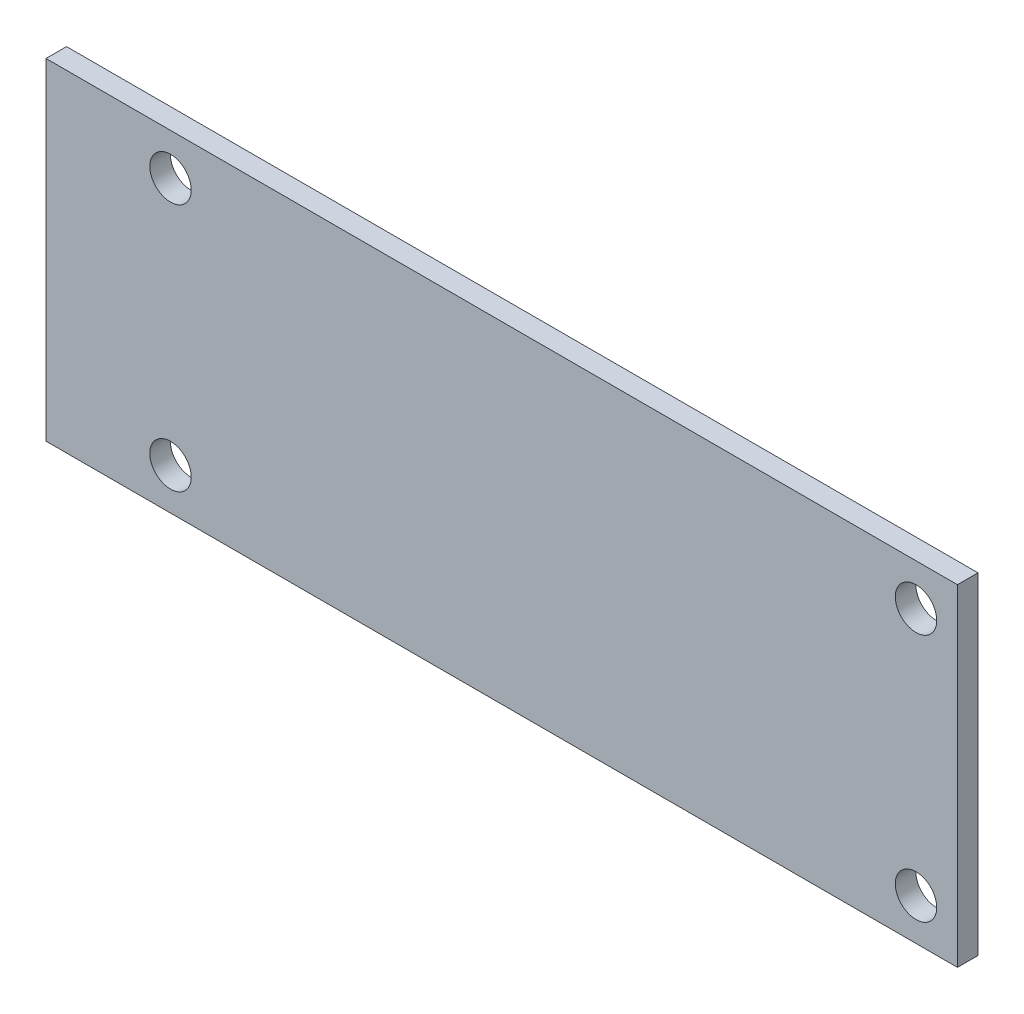
ISO-10303-21;
HEADER;
FILE_DESCRIPTION(('STEP AP214'),'2;1');
FILE_NAME('part.step','',(''),(''),'','','');
FILE_SCHEMA(('AUTOMOTIVE_DESIGN { 1 0 10303 214 1 1 1 1 }'));
ENDSEC;
DATA;
#1=APPLICATION_CONTEXT('core data for automotive mechanical design processes');
#2=APPLICATION_PROTOCOL_DEFINITION('international standard','automotive_design',2000,#1);
#3=PRODUCT_CONTEXT('',#1,'mechanical');
#4=PRODUCT('Part','Part','',(#3));
#5=PRODUCT_RELATED_PRODUCT_CATEGORY('part','',(#4));
#6=PRODUCT_DEFINITION_FORMATION('','',#4);
#7=PRODUCT_DEFINITION_CONTEXT('part definition',#1,'design');
#8=PRODUCT_DEFINITION('design','',#6,#7);
#9=PRODUCT_DEFINITION_SHAPE('','',#8);
#10=(LENGTH_UNIT() NAMED_UNIT(*) SI_UNIT(.MILLI.,.METRE.));
#11=(NAMED_UNIT(*) PLANE_ANGLE_UNIT() SI_UNIT($,.RADIAN.));
#12=(NAMED_UNIT(*) SI_UNIT($,.STERADIAN.) SOLID_ANGLE_UNIT());
#13=UNCERTAINTY_MEASURE_WITH_UNIT(LENGTH_MEASURE(1.E-05),#10,'distance_accuracy_value','');
#14=(GEOMETRIC_REPRESENTATION_CONTEXT(3) GLOBAL_UNCERTAINTY_ASSIGNED_CONTEXT((#13)) GLOBAL_UNIT_ASSIGNED_CONTEXT((#10,
#11,#12)) REPRESENTATION_CONTEXT('',''));
#15=CARTESIAN_POINT('',(0.,0.,0.));
#16=DIRECTION('',(0.,0.,1.));
#17=DIRECTION('',(1.,0.,0.));
#18=AXIS2_PLACEMENT_3D('',#15,#16,#17);
#19=CARTESIAN_POINT('',(34.925,-12.7,1.5748));
#20=DIRECTION('',(-1.,0.,0.));
#21=DIRECTION('',(0.,0.,1.));
#22=AXIS2_PLACEMENT_3D('',#19,#20,#21);
#23=PLANE('',#22);
#24=DIRECTION('',(0.,1.,0.));
#25=VECTOR('',#24,1.);
#26=CARTESIAN_POINT('',(34.925,-12.7,0.));
#27=LINE('',#26,#25);
#28=CARTESIAN_POINT('',(34.925,-12.7,0.));
#29=VERTEX_POINT('',#28);
#30=CARTESIAN_POINT('',(34.925,12.7,0.));
#31=VERTEX_POINT('',#30);
#32=EDGE_CURVE('E98',#29,#31,#27,.T.);
#33=ORIENTED_EDGE('',*,*,#32,.T.);
#34=DIRECTION('',(0.,0.,-1.));
#35=VECTOR('',#34,1.);
#36=CARTESIAN_POINT('',(34.925,12.7,1.5748));
#37=LINE('',#36,#35);
#38=CARTESIAN_POINT('',(34.925,12.7,1.5748));
#39=VERTEX_POINT('',#38);
#40=EDGE_CURVE('E11',#39,#31,#37,.T.);
#41=ORIENTED_EDGE('',*,*,#40,.F.);
#42=DIRECTION('',(0.,1.,0.));
#43=VECTOR('',#42,1.);
#44=CARTESIAN_POINT('',(34.925,-12.7,1.5748));
#45=LINE('',#44,#43);
#46=CARTESIAN_POINT('',(34.925,-12.7,1.5748));
#47=VERTEX_POINT('',#46);
#48=EDGE_CURVE('E85',#47,#39,#45,.T.);
#49=ORIENTED_EDGE('',*,*,#48,.F.);
#50=DIRECTION('',(0.,0.,-1.));
#51=VECTOR('',#50,1.);
#52=CARTESIAN_POINT('',(34.925,-12.7,1.5748));
#53=LINE('',#52,#51);
#54=EDGE_CURVE('E94',#47,#29,#53,.T.);
#55=ORIENTED_EDGE('',*,*,#54,.T.);
#56=EDGE_LOOP('',(#33,#41,#49,#55));
#57=FACE_BOUND('',#56,.T.);
#58=ADVANCED_FACE('F32',(#57),#23,.F.);
#59=CARTESIAN_POINT('',(-34.925,12.7,1.5748));
#60=DIRECTION('',(0.,-1.,0.));
#61=DIRECTION('',(0.,0.,-1.));
#62=AXIS2_PLACEMENT_3D('',#59,#60,#61);
#63=PLANE('',#62);
#64=DIRECTION('',(-1.,0.,0.));
#65=VECTOR('',#64,1.);
#66=CARTESIAN_POINT('',(-34.925,12.7,0.));
#67=LINE('',#66,#65);
#68=CARTESIAN_POINT('',(-34.925,12.7,0.));
#69=VERTEX_POINT('',#68);
#70=EDGE_CURVE('E89',#31,#69,#67,.T.);
#71=ORIENTED_EDGE('',*,*,#70,.T.);
#72=DIRECTION('',(0.,0.,-1.));
#73=VECTOR('',#72,1.);
#74=CARTESIAN_POINT('',(-34.925,12.7,1.5748));
#75=LINE('',#74,#73);
#76=CARTESIAN_POINT('',(-34.925,12.7,1.5748));
#77=VERTEX_POINT('',#76);
#78=EDGE_CURVE('E41',#77,#69,#75,.T.);
#79=ORIENTED_EDGE('',*,*,#78,.F.);
#80=DIRECTION('',(-1.,0.,0.));
#81=VECTOR('',#80,1.);
#82=CARTESIAN_POINT('',(-34.925,12.7,1.5748));
#83=LINE('',#82,#81);
#84=EDGE_CURVE('E80',#39,#77,#83,.T.);
#85=ORIENTED_EDGE('',*,*,#84,.F.);
#86=ORIENTED_EDGE('',*,*,#40,.T.);
#87=EDGE_LOOP('',(#71,#79,#85,#86));
#88=FACE_BOUND('',#87,.T.);
#89=ADVANCED_FACE('F88',(#88),#63,.F.);
#90=CARTESIAN_POINT('',(-34.925,-12.7,1.5748));
#91=DIRECTION('',(1.,0.,0.));
#92=DIRECTION('',(0.,0.,-1.));
#93=AXIS2_PLACEMENT_3D('',#90,#91,#92);
#94=PLANE('',#93);
#95=DIRECTION('',(0.,-1.,0.));
#96=VECTOR('',#95,1.);
#97=CARTESIAN_POINT('',(-34.925,-12.7,0.));
#98=LINE('',#97,#96);
#99=CARTESIAN_POINT('',(-34.925,-12.7,0.));
#100=VERTEX_POINT('',#99);
#101=EDGE_CURVE('E67',#69,#100,#98,.T.);
#102=ORIENTED_EDGE('',*,*,#101,.T.);
#103=DIRECTION('',(0.,0.,-1.));
#104=VECTOR('',#103,1.);
#105=CARTESIAN_POINT('',(-34.925,-12.7,1.5748));
#106=LINE('',#105,#104);
#107=CARTESIAN_POINT('',(-34.925,-12.7,1.5748));
#108=VERTEX_POINT('',#107);
#109=EDGE_CURVE('E90',#108,#100,#106,.T.);
#110=ORIENTED_EDGE('',*,*,#109,.F.);
#111=DIRECTION('',(0.,-1.,0.));
#112=VECTOR('',#111,1.);
#113=CARTESIAN_POINT('',(-34.925,-12.7,1.5748));
#114=LINE('',#113,#112);
#115=EDGE_CURVE('E83',#77,#108,#114,.T.);
#116=ORIENTED_EDGE('',*,*,#115,.F.);
#117=ORIENTED_EDGE('',*,*,#78,.T.);
#118=EDGE_LOOP('',(#102,#110,#116,#117));
#119=FACE_BOUND('',#118,.T.);
#120=ADVANCED_FACE('F92',(#119),#94,.F.);
#121=CARTESIAN_POINT('',(-34.925,-12.7,1.5748));
#122=DIRECTION('',(0.,1.,0.));
#123=DIRECTION('',(0.,0.,1.));
#124=AXIS2_PLACEMENT_3D('',#121,#122,#123);
#125=PLANE('',#124);
#126=DIRECTION('',(1.,0.,0.));
#127=VECTOR('',#126,1.);
#128=CARTESIAN_POINT('',(-34.925,-12.7,0.));
#129=LINE('',#128,#127);
#130=EDGE_CURVE('E73',#100,#29,#129,.T.);
#131=ORIENTED_EDGE('',*,*,#130,.T.);
#132=ORIENTED_EDGE('',*,*,#54,.F.);
#133=DIRECTION('',(1.,0.,0.));
#134=VECTOR('',#133,1.);
#135=CARTESIAN_POINT('',(-34.925,-12.7,1.5748));
#136=LINE('',#135,#134);
#137=EDGE_CURVE('E50',#108,#47,#136,.T.);
#138=ORIENTED_EDGE('',*,*,#137,.F.);
#139=ORIENTED_EDGE('',*,*,#109,.T.);
#140=EDGE_LOOP('',(#131,#132,#138,#139));
#141=FACE_BOUND('',#140,.T.);
#142=ADVANCED_FACE('F141',(#141),#125,.F.);
#143=CARTESIAN_POINT('',(34.925,12.7,1.5748));
#144=DIRECTION('',(0.,0.,-1.));
#145=DIRECTION('',(-1.,0.,0.));
#146=AXIS2_PLACEMENT_3D('',#143,#144,#145);
#147=PLANE('',#146);
#148=CARTESIAN_POINT('',(-25.38222,-9.525,1.5748));
#149=DIRECTION('',(0.,0.,1.));
#150=DIRECTION('',(1.,0.,0.));
#151=AXIS2_PLACEMENT_3D('',#148,#149,#150);
#152=CIRCLE('',#151,1.5875);
#153=CARTESIAN_POINT('',(-23.79472,-9.525,1.5748));
#154=VERTEX_POINT('',#153);
#155=EDGE_CURVE('E123',#154,#154,#152,.T.);
#156=ORIENTED_EDGE('',*,*,#155,.F.);
#157=EDGE_LOOP('',(#156));
#158=FACE_BOUND('',#157,.T.);
#159=CARTESIAN_POINT('',(31.75,-9.525,1.5748));
#160=DIRECTION('',(0.,0.,1.));
#161=DIRECTION('',(1.,0.,0.));
#162=AXIS2_PLACEMENT_3D('',#159,#160,#161);
#163=CIRCLE('',#162,1.5875);
#164=CARTESIAN_POINT('',(33.3375,-9.525,1.5748));
#165=VERTEX_POINT('',#164);
#166=EDGE_CURVE('E113',#165,#165,#163,.T.);
#167=ORIENTED_EDGE('',*,*,#166,.F.);
#168=EDGE_LOOP('',(#167));
#169=FACE_BOUND('',#168,.T.);
#170=CARTESIAN_POINT('',(-25.38222,9.525,1.5748));
#171=DIRECTION('',(0.,0.,1.));
#172=DIRECTION('',(1.,0.,0.));
#173=AXIS2_PLACEMENT_3D('',#170,#171,#172);
#174=CIRCLE('',#173,1.5875);
#175=CARTESIAN_POINT('',(-23.79472,9.525,1.5748));
#176=VERTEX_POINT('',#175);
#177=EDGE_CURVE('E110',#176,#176,#174,.T.);
#178=ORIENTED_EDGE('',*,*,#177,.F.);
#179=EDGE_LOOP('',(#178));
#180=FACE_BOUND('',#179,.T.);
#181=CARTESIAN_POINT('',(31.75,9.525,1.5748));
#182=DIRECTION('',(0.,0.,1.));
#183=DIRECTION('',(1.,0.,0.));
#184=AXIS2_PLACEMENT_3D('',#181,#182,#183);
#185=CIRCLE('',#184,1.5875);
#186=CARTESIAN_POINT('',(33.3375,9.525,1.5748));
#187=VERTEX_POINT('',#186);
#188=EDGE_CURVE('E109',#187,#187,#185,.T.);
#189=ORIENTED_EDGE('',*,*,#188,.F.);
#190=EDGE_LOOP('',(#189));
#191=FACE_BOUND('',#190,.T.);
#192=ORIENTED_EDGE('',*,*,#48,.T.);
#193=ORIENTED_EDGE('',*,*,#84,.T.);
#194=ORIENTED_EDGE('',*,*,#115,.T.);
#195=ORIENTED_EDGE('',*,*,#137,.T.);
#196=EDGE_LOOP('',(#192,#193,#194,#195));
#197=FACE_BOUND('',#196,.T.);
#198=ADVANCED_FACE('F81',(#158,#169,#180,#191,#197),#147,.F.);
#199=CARTESIAN_POINT('',(34.925,12.7,0.));
#200=DIRECTION('',(0.,0.,-1.));
#201=DIRECTION('',(-1.,0.,0.));
#202=AXIS2_PLACEMENT_3D('',#199,#200,#201);
#203=PLANE('',#202);
#204=CARTESIAN_POINT('',(-25.38222,-9.525,0.));
#205=DIRECTION('',(0.,0.,-1.));
#206=DIRECTION('',(-1.,0.,0.));
#207=AXIS2_PLACEMENT_3D('',#204,#205,#206);
#208=CIRCLE('',#207,1.5875);
#209=CARTESIAN_POINT('',(-26.96972,-9.525,0.));
#210=VERTEX_POINT('',#209);
#211=EDGE_CURVE('E35',#210,#210,#208,.T.);
#212=ORIENTED_EDGE('',*,*,#211,.F.);
#213=EDGE_LOOP('',(#212));
#214=FACE_BOUND('',#213,.T.);
#215=CARTESIAN_POINT('',(31.75,-9.525,0.));
#216=DIRECTION('',(0.,0.,-1.));
#217=DIRECTION('',(-1.,0.,0.));
#218=AXIS2_PLACEMENT_3D('',#215,#216,#217);
#219=CIRCLE('',#218,1.5875);
#220=CARTESIAN_POINT('',(30.1625,-9.525,0.));
#221=VERTEX_POINT('',#220);
#222=EDGE_CURVE('E111',#221,#221,#219,.T.);
#223=ORIENTED_EDGE('',*,*,#222,.F.);
#224=EDGE_LOOP('',(#223));
#225=FACE_BOUND('',#224,.T.);
#226=CARTESIAN_POINT('',(-25.38222,9.525,0.));
#227=DIRECTION('',(0.,0.,-1.));
#228=DIRECTION('',(-1.,0.,0.));
#229=AXIS2_PLACEMENT_3D('',#226,#227,#228);
#230=CIRCLE('',#229,1.5875);
#231=CARTESIAN_POINT('',(-26.96972,9.525,0.));
#232=VERTEX_POINT('',#231);
#233=EDGE_CURVE('E107',#232,#232,#230,.T.);
#234=ORIENTED_EDGE('',*,*,#233,.F.);
#235=EDGE_LOOP('',(#234));
#236=FACE_BOUND('',#235,.T.);
#237=CARTESIAN_POINT('',(31.75,9.525,0.));
#238=DIRECTION('',(0.,0.,-1.));
#239=DIRECTION('',(-1.,0.,0.));
#240=AXIS2_PLACEMENT_3D('',#237,#238,#239);
#241=CIRCLE('',#240,1.5875);
#242=CARTESIAN_POINT('',(30.1625,9.525,0.));
#243=VERTEX_POINT('',#242);
#244=EDGE_CURVE('E101',#243,#243,#241,.T.);
#245=ORIENTED_EDGE('',*,*,#244,.F.);
#246=EDGE_LOOP('',(#245));
#247=FACE_BOUND('',#246,.T.);
#248=ORIENTED_EDGE('',*,*,#32,.F.);
#249=ORIENTED_EDGE('',*,*,#130,.F.);
#250=ORIENTED_EDGE('',*,*,#101,.F.);
#251=ORIENTED_EDGE('',*,*,#70,.F.);
#252=EDGE_LOOP('',(#248,#249,#250,#251));
#253=FACE_BOUND('',#252,.T.);
#254=ADVANCED_FACE('F134',(#214,#225,#236,#247,#253),#203,.T.);
#255=CARTESIAN_POINT('',(31.75,9.525,1.5748));
#256=DIRECTION('',(0.,0.,1.));
#257=DIRECTION('',(1.,0.,0.));
#258=AXIS2_PLACEMENT_3D('',#255,#256,#257);
#259=CYLINDRICAL_SURFACE('',#258,1.5875);
#260=ORIENTED_EDGE('',*,*,#244,.T.);
#261=EDGE_LOOP('',(#260));
#262=FACE_BOUND('',#261,.T.);
#263=ORIENTED_EDGE('',*,*,#188,.T.);
#264=EDGE_LOOP('',(#263));
#265=FACE_BOUND('',#264,.T.);
#266=ADVANCED_FACE('F131',(#262,#265),#259,.F.);
#267=CARTESIAN_POINT('',(-25.38222,9.525,1.5748));
#268=DIRECTION('',(0.,0.,1.));
#269=DIRECTION('',(1.,0.,0.));
#270=AXIS2_PLACEMENT_3D('',#267,#268,#269);
#271=CYLINDRICAL_SURFACE('',#270,1.5875);
#272=ORIENTED_EDGE('',*,*,#233,.T.);
#273=EDGE_LOOP('',(#272));
#274=FACE_BOUND('',#273,.T.);
#275=ORIENTED_EDGE('',*,*,#177,.T.);
#276=EDGE_LOOP('',(#275));
#277=FACE_BOUND('',#276,.T.);
#278=ADVANCED_FACE('F175',(#274,#277),#271,.F.);
#279=CARTESIAN_POINT('',(31.75,-9.525,1.5748));
#280=DIRECTION('',(0.,0.,1.));
#281=DIRECTION('',(1.,0.,0.));
#282=AXIS2_PLACEMENT_3D('',#279,#280,#281);
#283=CYLINDRICAL_SURFACE('',#282,1.5875);
#284=ORIENTED_EDGE('',*,*,#222,.T.);
#285=EDGE_LOOP('',(#284));
#286=FACE_BOUND('',#285,.T.);
#287=ORIENTED_EDGE('',*,*,#166,.T.);
#288=EDGE_LOOP('',(#287));
#289=FACE_BOUND('',#288,.T.);
#290=ADVANCED_FACE('F185',(#286,#289),#283,.F.);
#291=CARTESIAN_POINT('',(-25.38222,-9.525,1.5748));
#292=DIRECTION('',(0.,0.,1.));
#293=DIRECTION('',(1.,0.,0.));
#294=AXIS2_PLACEMENT_3D('',#291,#292,#293);
#295=CYLINDRICAL_SURFACE('',#294,1.5875);
#296=ORIENTED_EDGE('',*,*,#211,.T.);
#297=EDGE_LOOP('',(#296));
#298=FACE_BOUND('',#297,.T.);
#299=ORIENTED_EDGE('',*,*,#155,.T.);
#300=EDGE_LOOP('',(#299));
#301=FACE_BOUND('',#300,.T.);
#302=ADVANCED_FACE('F205',(#298,#301),#295,.F.);
#303=CLOSED_SHELL('',(#58,#89,#120,#142,#198,#254,#266,#278,#290,#302));
#304=MANIFOLD_SOLID_BREP('B2',#303);
#305=ADVANCED_BREP_SHAPE_REPRESENTATION('',(#18,#304),#14);
#306=SHAPE_DEFINITION_REPRESENTATION(#9,#305);
ENDSEC;
END-ISO-10303-21;
